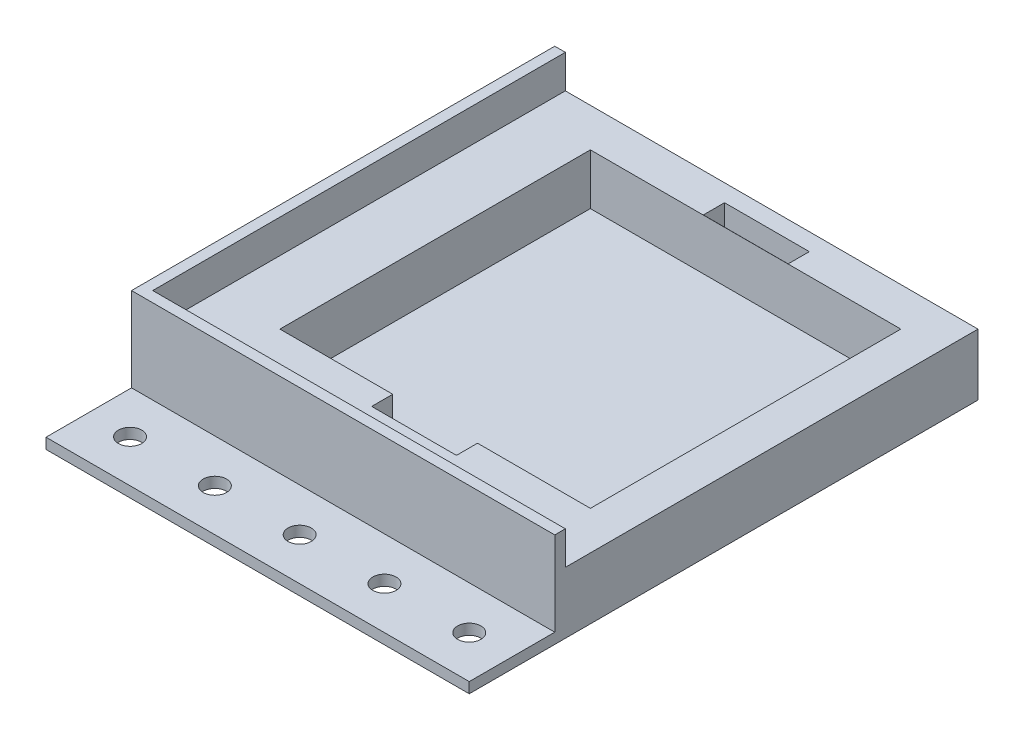
ISO-10303-21;
HEADER;
FILE_DESCRIPTION(('STEP AP214'),'2;1');
FILE_NAME('part.step','',(''),(''),'','','');
FILE_SCHEMA(('AUTOMOTIVE_DESIGN { 1 0 10303 214 1 1 1 1 }'));
ENDSEC;
DATA;
#1=APPLICATION_CONTEXT('core data for automotive mechanical design processes');
#2=APPLICATION_PROTOCOL_DEFINITION('international standard','automotive_design',2000,#1);
#3=PRODUCT_CONTEXT('',#1,'mechanical');
#4=PRODUCT('Part','Part','',(#3));
#5=PRODUCT_RELATED_PRODUCT_CATEGORY('part','',(#4));
#6=PRODUCT_DEFINITION_FORMATION('','',#4);
#7=PRODUCT_DEFINITION_CONTEXT('part definition',#1,'design');
#8=PRODUCT_DEFINITION('design','',#6,#7);
#9=PRODUCT_DEFINITION_SHAPE('','',#8);
#10=(LENGTH_UNIT() NAMED_UNIT(*) SI_UNIT(.MILLI.,.METRE.));
#11=(NAMED_UNIT(*) PLANE_ANGLE_UNIT() SI_UNIT($,.RADIAN.));
#12=(NAMED_UNIT(*) SI_UNIT($,.STERADIAN.) SOLID_ANGLE_UNIT());
#13=UNCERTAINTY_MEASURE_WITH_UNIT(LENGTH_MEASURE(1.E-05),#10,'distance_accuracy_value','');
#14=(GEOMETRIC_REPRESENTATION_CONTEXT(3) GLOBAL_UNCERTAINTY_ASSIGNED_CONTEXT((#13)) GLOBAL_UNIT_ASSIGNED_CONTEXT((#10,
#11,#12)) REPRESENTATION_CONTEXT('',''));
#15=CARTESIAN_POINT('',(0.,0.,0.));
#16=DIRECTION('',(0.,0.,1.));
#17=DIRECTION('',(1.,0.,0.));
#18=AXIS2_PLACEMENT_3D('',#15,#16,#17);
#19=CARTESIAN_POINT('',(0.,0.,0.));
#20=DIRECTION('',(0.,-1.,0.));
#21=DIRECTION('',(0.,0.,-1.));
#22=AXIS2_PLACEMENT_3D('',#19,#20,#21);
#23=PLANE('',#22);
#24=CARTESIAN_POINT('',(-12.7,0.,139.7));
#25=DIRECTION('',(0.,1.,0.));
#26=DIRECTION('',(0.,0.,1.));
#27=AXIS2_PLACEMENT_3D('',#24,#25,#26);
#28=CIRCLE('',#27,3.4925);
#29=CARTESIAN_POINT('',(-12.7,0.,143.1925));
#30=VERTEX_POINT('',#29);
#31=EDGE_CURVE('E273',#30,#30,#28,.T.);
#32=ORIENTED_EDGE('',*,*,#31,.F.);
#33=EDGE_LOOP('',(#32));
#34=FACE_BOUND('',#33,.T.);
#35=CARTESIAN_POINT('',(-38.1,0.,139.7));
#36=DIRECTION('',(0.,1.,0.));
#37=DIRECTION('',(0.,0.,1.));
#38=AXIS2_PLACEMENT_3D('',#35,#36,#37);
#39=CIRCLE('',#38,3.4925);
#40=CARTESIAN_POINT('',(-38.1,0.,143.1925));
#41=VERTEX_POINT('',#40);
#42=EDGE_CURVE('E296',#41,#41,#39,.T.);
#43=ORIENTED_EDGE('',*,*,#42,.F.);
#44=EDGE_LOOP('',(#43));
#45=FACE_BOUND('',#44,.T.);
#46=CARTESIAN_POINT('',(-63.5,0.,139.7));
#47=DIRECTION('',(0.,1.,0.));
#48=DIRECTION('',(0.,0.,1.));
#49=AXIS2_PLACEMENT_3D('',#46,#47,#48);
#50=CIRCLE('',#49,3.4925);
#51=CARTESIAN_POINT('',(-63.5,0.,143.1925));
#52=VERTEX_POINT('',#51);
#53=EDGE_CURVE('E290',#52,#52,#50,.T.);
#54=ORIENTED_EDGE('',*,*,#53,.F.);
#55=EDGE_LOOP('',(#54));
#56=FACE_BOUND('',#55,.T.);
#57=CARTESIAN_POINT('',(-88.9,0.,139.7));
#58=DIRECTION('',(0.,1.,0.));
#59=DIRECTION('',(0.,0.,1.));
#60=AXIS2_PLACEMENT_3D('',#57,#58,#59);
#61=CIRCLE('',#60,3.4925);
#62=CARTESIAN_POINT('',(-88.9,0.,143.1925));
#63=VERTEX_POINT('',#62);
#64=EDGE_CURVE('E284',#63,#63,#61,.T.);
#65=ORIENTED_EDGE('',*,*,#64,.F.);
#66=EDGE_LOOP('',(#65));
#67=FACE_BOUND('',#66,.T.);
#68=CARTESIAN_POINT('',(-114.3,0.,139.7));
#69=DIRECTION('',(0.,1.,0.));
#70=DIRECTION('',(0.,0.,1.));
#71=AXIS2_PLACEMENT_3D('',#68,#69,#70);
#72=CIRCLE('',#71,3.4925);
#73=CARTESIAN_POINT('',(-114.3,0.,143.1925));
#74=VERTEX_POINT('',#73);
#75=EDGE_CURVE('E278',#74,#74,#72,.T.);
#76=ORIENTED_EDGE('',*,*,#75,.F.);
#77=EDGE_LOOP('',(#76));
#78=FACE_BOUND('',#77,.T.);
#79=DIRECTION('',(0.,0.,1.));
#80=VECTOR('',#79,1.);
#81=CARTESIAN_POINT('',(0.,0.,0.));
#82=LINE('',#81,#80);
#83=CARTESIAN_POINT('',(0.,0.,126.782));
#84=VERTEX_POINT('',#83);
#85=CARTESIAN_POINT('',(0.,0.,152.4));
#86=VERTEX_POINT('',#85);
#87=EDGE_CURVE('E195',#84,#86,#82,.T.);
#88=ORIENTED_EDGE('',*,*,#87,.F.);
#89=DIRECTION('',(1.,0.,0.));
#90=VECTOR('',#89,1.);
#91=CARTESIAN_POINT('',(-126.782,0.,126.782));
#92=LINE('',#91,#90);
#93=CARTESIAN_POINT('',(-126.782,0.,126.782));
#94=VERTEX_POINT('',#93);
#95=EDGE_CURVE('E307',#94,#84,#92,.T.);
#96=ORIENTED_EDGE('',*,*,#95,.F.);
#97=DIRECTION('',(0.,0.,1.));
#98=VECTOR('',#97,1.);
#99=CARTESIAN_POINT('',(-126.782,0.,0.));
#100=LINE('',#99,#98);
#101=CARTESIAN_POINT('',(-126.782,0.,152.4));
#102=VERTEX_POINT('',#101);
#103=EDGE_CURVE('E214',#94,#102,#100,.T.);
#104=ORIENTED_EDGE('',*,*,#103,.T.);
#105=DIRECTION('',(-1.,0.,0.));
#106=VECTOR('',#105,1.);
#107=CARTESIAN_POINT('',(-152.4,0.,152.4));
#108=LINE('',#107,#106);
#109=EDGE_CURVE('E312',#86,#102,#108,.T.);
#110=ORIENTED_EDGE('',*,*,#109,.F.);
#111=EDGE_LOOP('',(#88,#96,#104,#110));
#112=FACE_BOUND('',#111,.T.);
#113=ADVANCED_FACE('F37',(#34,#45,#56,#67,#78,#112),#23,.F.);
#114=CARTESIAN_POINT('',(0.,-3.175,0.));
#115=DIRECTION('',(0.,-1.,0.));
#116=DIRECTION('',(0.,0.,-1.));
#117=AXIS2_PLACEMENT_3D('',#114,#115,#116);
#118=PLANE('',#117);
#119=CARTESIAN_POINT('',(-12.7,-3.175,139.7));
#120=DIRECTION('',(0.,1.,0.));
#121=DIRECTION('',(0.,0.,1.));
#122=AXIS2_PLACEMENT_3D('',#119,#120,#121);
#123=CIRCLE('',#122,3.4925);
#124=CARTESIAN_POINT('',(-12.7,-3.175,143.1925));
#125=VERTEX_POINT('',#124);
#126=EDGE_CURVE('E299',#125,#125,#123,.T.);
#127=ORIENTED_EDGE('',*,*,#126,.T.);
#128=EDGE_LOOP('',(#127));
#129=FACE_BOUND('',#128,.T.);
#130=CARTESIAN_POINT('',(-38.1,-3.175,139.7));
#131=DIRECTION('',(0.,1.,0.));
#132=DIRECTION('',(0.,0.,1.));
#133=AXIS2_PLACEMENT_3D('',#130,#131,#132);
#134=CIRCLE('',#133,3.4925);
#135=CARTESIAN_POINT('',(-38.1,-3.175,143.1925));
#136=VERTEX_POINT('',#135);
#137=EDGE_CURVE('E293',#136,#136,#134,.T.);
#138=ORIENTED_EDGE('',*,*,#137,.T.);
#139=EDGE_LOOP('',(#138));
#140=FACE_BOUND('',#139,.T.);
#141=CARTESIAN_POINT('',(-63.5,-3.175,139.7));
#142=DIRECTION('',(0.,1.,0.));
#143=DIRECTION('',(0.,0.,1.));
#144=AXIS2_PLACEMENT_3D('',#141,#142,#143);
#145=CIRCLE('',#144,3.4925);
#146=CARTESIAN_POINT('',(-63.5,-3.175,143.1925));
#147=VERTEX_POINT('',#146);
#148=EDGE_CURVE('E287',#147,#147,#145,.T.);
#149=ORIENTED_EDGE('',*,*,#148,.T.);
#150=EDGE_LOOP('',(#149));
#151=FACE_BOUND('',#150,.T.);
#152=CARTESIAN_POINT('',(-88.9,-3.175,139.7));
#153=DIRECTION('',(0.,1.,0.));
#154=DIRECTION('',(0.,0.,1.));
#155=AXIS2_PLACEMENT_3D('',#152,#153,#154);
#156=CIRCLE('',#155,3.4925);
#157=CARTESIAN_POINT('',(-88.9,-3.175,143.1925));
#158=VERTEX_POINT('',#157);
#159=EDGE_CURVE('E281',#158,#158,#156,.T.);
#160=ORIENTED_EDGE('',*,*,#159,.T.);
#161=EDGE_LOOP('',(#160));
#162=FACE_BOUND('',#161,.T.);
#163=CARTESIAN_POINT('',(-114.3,-3.175,139.7));
#164=DIRECTION('',(0.,1.,0.));
#165=DIRECTION('',(0.,0.,1.));
#166=AXIS2_PLACEMENT_3D('',#163,#164,#165);
#167=CIRCLE('',#166,3.4925);
#168=CARTESIAN_POINT('',(-114.3,-3.175,143.1925));
#169=VERTEX_POINT('',#168);
#170=EDGE_CURVE('E274',#169,#169,#167,.T.);
#171=ORIENTED_EDGE('',*,*,#170,.T.);
#172=EDGE_LOOP('',(#171));
#173=FACE_BOUND('',#172,.T.);
#174=DIRECTION('',(0.,0.,1.));
#175=VECTOR('',#174,1.);
#176=CARTESIAN_POINT('',(-126.782,-3.175,0.));
#177=LINE('',#176,#175);
#178=CARTESIAN_POINT('',(-126.782,-3.175,0.));
#179=VERTEX_POINT('',#178);
#180=CARTESIAN_POINT('',(-126.782,-3.175,152.4));
#181=VERTEX_POINT('',#180);
#182=EDGE_CURVE('E198',#179,#181,#177,.T.);
#183=ORIENTED_EDGE('',*,*,#182,.F.);
#184=DIRECTION('',(-1.,0.,0.));
#185=VECTOR('',#184,1.);
#186=CARTESIAN_POINT('',(-142.114384532222,-3.175,0.));
#187=LINE('',#186,#185);
#188=CARTESIAN_POINT('',(0.,-3.175,0.));
#189=VERTEX_POINT('',#188);
#190=EDGE_CURVE('E188',#189,#179,#187,.T.);
#191=ORIENTED_EDGE('',*,*,#190,.F.);
#192=DIRECTION('',(0.,0.,-1.));
#193=VECTOR('',#192,1.);
#194=CARTESIAN_POINT('',(0.,-3.175,0.));
#195=LINE('',#194,#193);
#196=CARTESIAN_POINT('',(0.,-3.175,152.4));
#197=VERTEX_POINT('',#196);
#198=EDGE_CURVE('E180',#197,#189,#195,.T.);
#199=ORIENTED_EDGE('',*,*,#198,.F.);
#200=DIRECTION('',(-1.,0.,0.));
#201=VECTOR('',#200,1.);
#202=CARTESIAN_POINT('',(-152.4,-3.175,152.4));
#203=LINE('',#202,#201);
#204=EDGE_CURVE('E60',#197,#181,#203,.T.);
#205=ORIENTED_EDGE('',*,*,#204,.T.);
#206=EDGE_LOOP('',(#183,#191,#199,#205));
#207=FACE_BOUND('',#206,.T.);
#208=ADVANCED_FACE('F197',(#129,#140,#151,#162,#173,#207),#118,.T.);
#209=CARTESIAN_POINT('',(-152.4,15.24,152.4));
#210=DIRECTION('',(0.,0.,-1.));
#211=DIRECTION('',(-1.,0.,0.));
#212=AXIS2_PLACEMENT_3D('',#209,#210,#211);
#213=PLANE('',#212);
#214=DIRECTION('',(0.,-1.,0.));
#215=VECTOR('',#214,1.);
#216=CARTESIAN_POINT('',(0.,15.24,152.4));
#217=LINE('',#216,#215);
#218=EDGE_CURVE('E186',#86,#197,#217,.T.);
#219=ORIENTED_EDGE('',*,*,#218,.F.);
#220=ORIENTED_EDGE('',*,*,#109,.T.);
#221=DIRECTION('',(0.,-1.,0.));
#222=VECTOR('',#221,1.);
#223=CARTESIAN_POINT('',(-126.782,15.24,152.4));
#224=LINE('',#223,#222);
#225=EDGE_CURVE('E364',#102,#181,#224,.T.);
#226=ORIENTED_EDGE('',*,*,#225,.T.);
#227=ORIENTED_EDGE('',*,*,#204,.F.);
#228=EDGE_LOOP('',(#219,#220,#226,#227));
#229=FACE_BOUND('',#228,.T.);
#230=ADVANCED_FACE('F39',(#229),#213,.F.);
#231=CARTESIAN_POINT('',(0.,25.24,0.));
#232=DIRECTION('',(0.,-1.,0.));
#233=DIRECTION('',(0.,0.,-1.));
#234=AXIS2_PLACEMENT_3D('',#231,#232,#233);
#235=PLANE('',#234);
#236=DIRECTION('',(-1.,0.,0.));
#237=VECTOR('',#236,1.);
#238=CARTESIAN_POINT('',(-142.114384532222,25.24,0.));
#239=LINE('',#238,#237);
#240=CARTESIAN_POINT('',(-123.607,25.24,0.));
#241=VERTEX_POINT('',#240);
#242=CARTESIAN_POINT('',(-126.782,25.24,0.));
#243=VERTEX_POINT('',#242);
#244=EDGE_CURVE('E189',#241,#243,#239,.T.);
#245=ORIENTED_EDGE('',*,*,#244,.T.);
#246=DIRECTION('',(0.,0.,1.));
#247=VECTOR('',#246,1.);
#248=CARTESIAN_POINT('',(-126.782,25.24,-126.782));
#249=LINE('',#248,#247);
#250=CARTESIAN_POINT('',(-126.782,25.24,126.782));
#251=VERTEX_POINT('',#250);
#252=EDGE_CURVE('E277',#243,#251,#249,.T.);
#253=ORIENTED_EDGE('',*,*,#252,.T.);
#254=DIRECTION('',(1.,0.,0.));
#255=VECTOR('',#254,1.);
#256=CARTESIAN_POINT('',(-126.782,25.24,126.782));
#257=LINE('',#256,#255);
#258=CARTESIAN_POINT('',(0.,25.24,126.782));
#259=VERTEX_POINT('',#258);
#260=EDGE_CURVE('E304',#251,#259,#257,.T.);
#261=ORIENTED_EDGE('',*,*,#260,.T.);
#262=DIRECTION('',(0.,0.,-1.));
#263=VECTOR('',#262,1.);
#264=CARTESIAN_POINT('',(0.,25.24,0.));
#265=LINE('',#264,#263);
#266=CARTESIAN_POINT('',(0.,25.24,123.607));
#267=VERTEX_POINT('',#266);
#268=EDGE_CURVE('E52',#259,#267,#265,.T.);
#269=ORIENTED_EDGE('',*,*,#268,.T.);
#270=DIRECTION('',(1.,0.,0.));
#271=VECTOR('',#270,1.);
#272=CARTESIAN_POINT('',(-123.607,25.24,123.607));
#273=LINE('',#272,#271);
#274=CARTESIAN_POINT('',(-123.607,25.24,123.607));
#275=VERTEX_POINT('',#274);
#276=EDGE_CURVE('E319',#275,#267,#273,.T.);
#277=ORIENTED_EDGE('',*,*,#276,.F.);
#278=DIRECTION('',(0.,0.,1.));
#279=VECTOR('',#278,1.);
#280=CARTESIAN_POINT('',(-123.607,25.24,123.607));
#281=LINE('',#280,#279);
#282=EDGE_CURVE('E317',#241,#275,#281,.T.);
#283=ORIENTED_EDGE('',*,*,#282,.F.);
#284=EDGE_LOOP('',(#245,#253,#261,#269,#277,#283));
#285=FACE_BOUND('',#284,.T.);
#286=ADVANCED_FACE('F374',(#285),#235,.F.);
#287=CARTESIAN_POINT('',(0.,15.24,0.));
#288=DIRECTION('',(0.,-1.,0.));
#289=DIRECTION('',(0.,0.,-1.));
#290=AXIS2_PLACEMENT_3D('',#287,#288,#289);
#291=PLANE('',#290);
#292=DIRECTION('',(1.,0.,0.));
#293=VECTOR('',#292,1.);
#294=CARTESIAN_POINT('',(-104.557,15.24,104.557));
#295=LINE('',#294,#293);
#296=CARTESIAN_POINT('',(-45.357,15.24,104.557));
#297=VERTEX_POINT('',#296);
#298=CARTESIAN_POINT('',(-11.557,15.24,104.557));
#299=VERTEX_POINT('',#298);
#300=EDGE_CURVE('E339',#297,#299,#295,.T.);
#301=ORIENTED_EDGE('',*,*,#300,.F.);
#302=DIRECTION('',(0.,0.,-1.));
#303=VECTOR('',#302,1.);
#304=CARTESIAN_POINT('',(-45.357,15.24,104.521));
#305=LINE('',#304,#303);
#306=CARTESIAN_POINT('',(-45.357,15.24,110.871));
#307=VERTEX_POINT('',#306);
#308=EDGE_CURVE('E218',#307,#297,#305,.T.);
#309=ORIENTED_EDGE('',*,*,#308,.F.);
#310=DIRECTION('',(1.,0.,0.));
#311=VECTOR('',#310,1.);
#312=CARTESIAN_POINT('',(-70.757,15.24,110.871));
#313=LINE('',#312,#311);
#314=CARTESIAN_POINT('',(-70.757,15.24,110.871));
#315=VERTEX_POINT('',#314);
#316=EDGE_CURVE('E221',#315,#307,#313,.T.);
#317=ORIENTED_EDGE('',*,*,#316,.F.);
#318=DIRECTION('',(0.,0.,1.));
#319=VECTOR('',#318,1.);
#320=CARTESIAN_POINT('',(-70.757,15.24,104.521));
#321=LINE('',#320,#319);
#322=CARTESIAN_POINT('',(-70.757,15.24,104.557));
#323=VERTEX_POINT('',#322);
#324=EDGE_CURVE('E217',#323,#315,#321,.T.);
#325=ORIENTED_EDGE('',*,*,#324,.F.);
#326=CARTESIAN_POINT('',(-104.557,15.24,104.557));
#327=VERTEX_POINT('',#326);
#328=EDGE_CURVE('E340',#327,#323,#295,.T.);
#329=ORIENTED_EDGE('',*,*,#328,.F.);
#330=DIRECTION('',(0.,0.,1.));
#331=VECTOR('',#330,1.);
#332=CARTESIAN_POINT('',(-104.557,15.24,11.557));
#333=LINE('',#332,#331);
#334=CARTESIAN_POINT('',(-104.557,15.24,11.557));
#335=VERTEX_POINT('',#334);
#336=EDGE_CURVE('E336',#335,#327,#333,.T.);
#337=ORIENTED_EDGE('',*,*,#336,.F.);
#338=DIRECTION('',(-1.,0.,0.));
#339=VECTOR('',#338,1.);
#340=CARTESIAN_POINT('',(-104.557,15.24,11.557));
#341=LINE('',#340,#339);
#342=CARTESIAN_POINT('',(-11.557,15.24,11.557));
#343=VERTEX_POINT('',#342);
#344=EDGE_CURVE('E333',#343,#335,#341,.T.);
#345=ORIENTED_EDGE('',*,*,#344,.F.);
#346=DIRECTION('',(0.,0.,-1.));
#347=VECTOR('',#346,1.);
#348=CARTESIAN_POINT('',(-11.557,15.24,11.557));
#349=LINE('',#348,#347);
#350=EDGE_CURVE('E331',#299,#343,#349,.T.);
#351=ORIENTED_EDGE('',*,*,#350,.F.);
#352=EDGE_LOOP('',(#301,#309,#317,#325,#329,#337,#345,#351));
#353=FACE_BOUND('',#352,.T.);
#354=DIRECTION('',(0.,0.,-1.));
#355=VECTOR('',#354,1.);
#356=CARTESIAN_POINT('',(-45.357,15.24,11.521));
#357=LINE('',#356,#355);
#358=CARTESIAN_POINT('',(-45.357,15.24,11.521));
#359=VERTEX_POINT('',#358);
#360=CARTESIAN_POINT('',(-45.357,15.24,5.17099999999997));
#361=VERTEX_POINT('',#360);
#362=EDGE_CURVE('E245',#359,#361,#357,.T.);
#363=ORIENTED_EDGE('',*,*,#362,.F.);
#364=DIRECTION('',(1.,0.,0.));
#365=VECTOR('',#364,1.);
#366=CARTESIAN_POINT('',(-70.757,15.24,11.521));
#367=LINE('',#366,#365);
#368=CARTESIAN_POINT('',(-70.757,15.24,11.521));
#369=VERTEX_POINT('',#368);
#370=EDGE_CURVE('E248',#369,#359,#367,.T.);
#371=ORIENTED_EDGE('',*,*,#370,.F.);
#372=DIRECTION('',(0.,0.,1.));
#373=VECTOR('',#372,1.);
#374=CARTESIAN_POINT('',(-70.757,15.24,11.521));
#375=LINE('',#374,#373);
#376=CARTESIAN_POINT('',(-70.757,15.24,5.17099999999997));
#377=VERTEX_POINT('',#376);
#378=EDGE_CURVE('E241',#377,#369,#375,.T.);
#379=ORIENTED_EDGE('',*,*,#378,.F.);
#380=DIRECTION('',(-1.,0.,0.));
#381=VECTOR('',#380,1.);
#382=CARTESIAN_POINT('',(-70.757,15.24,5.17099999999997));
#383=LINE('',#382,#381);
#384=EDGE_CURVE('E242',#361,#377,#383,.T.);
#385=ORIENTED_EDGE('',*,*,#384,.F.);
#386=EDGE_LOOP('',(#363,#371,#379,#385));
#387=FACE_BOUND('',#386,.T.);
#388=DIRECTION('',(1.,0.,0.));
#389=VECTOR('',#388,1.);
#390=CARTESIAN_POINT('',(0.,15.24,0.));
#391=LINE('',#390,#389);
#392=CARTESIAN_POINT('',(-123.607,15.24,0.));
#393=VERTEX_POINT('',#392);
#394=CARTESIAN_POINT('',(0.,15.24,0.));
#395=VERTEX_POINT('',#394);
#396=EDGE_CURVE('E194',#393,#395,#391,.T.);
#397=ORIENTED_EDGE('',*,*,#396,.F.);
#398=DIRECTION('',(0.,0.,1.));
#399=VECTOR('',#398,1.);
#400=CARTESIAN_POINT('',(-123.607,15.24,123.607));
#401=LINE('',#400,#399);
#402=CARTESIAN_POINT('',(-123.607,15.24,123.607));
#403=VERTEX_POINT('',#402);
#404=EDGE_CURVE('E316',#393,#403,#401,.T.);
#405=ORIENTED_EDGE('',*,*,#404,.T.);
#406=DIRECTION('',(1.,0.,0.));
#407=VECTOR('',#406,1.);
#408=CARTESIAN_POINT('',(-123.607,15.24,123.607));
#409=LINE('',#408,#407);
#410=CARTESIAN_POINT('',(0.,15.24,123.607));
#411=VERTEX_POINT('',#410);
#412=EDGE_CURVE('E320',#403,#411,#409,.T.);
#413=ORIENTED_EDGE('',*,*,#412,.T.);
#414=DIRECTION('',(0.,0.,1.));
#415=VECTOR('',#414,1.);
#416=CARTESIAN_POINT('',(0.,15.24,0.));
#417=LINE('',#416,#415);
#418=EDGE_CURVE('E207',#395,#411,#417,.T.);
#419=ORIENTED_EDGE('',*,*,#418,.F.);
#420=EDGE_LOOP('',(#397,#405,#413,#419));
#421=FACE_BOUND('',#420,.T.);
#422=ADVANCED_FACE('F392',(#353,#387,#421),#291,.F.);
#423=CARTESIAN_POINT('',(-123.607,25.24,123.607));
#424=DIRECTION('',(1.,0.,0.));
#425=DIRECTION('',(0.,0.,-1.));
#426=AXIS2_PLACEMENT_3D('',#423,#424,#425);
#427=PLANE('',#426);
#428=ORIENTED_EDGE('',*,*,#404,.F.);
#429=DIRECTION('',(0.,1.,0.));
#430=VECTOR('',#429,1.);
#431=CARTESIAN_POINT('',(-123.607,25.24,0.));
#432=LINE('',#431,#430);
#433=EDGE_CURVE('E209',#393,#241,#432,.T.);
#434=ORIENTED_EDGE('',*,*,#433,.T.);
#435=ORIENTED_EDGE('',*,*,#282,.T.);
#436=DIRECTION('',(0.,-1.,0.));
#437=VECTOR('',#436,1.);
#438=CARTESIAN_POINT('',(-123.607,25.24,123.607));
#439=LINE('',#438,#437);
#440=EDGE_CURVE('E323',#275,#403,#439,.T.);
#441=ORIENTED_EDGE('',*,*,#440,.T.);
#442=EDGE_LOOP('',(#428,#434,#435,#441));
#443=FACE_BOUND('',#442,.T.);
#444=ADVANCED_FACE('F386',(#443),#427,.T.);
#445=CARTESIAN_POINT('',(-123.607,25.24,123.607));
#446=DIRECTION('',(0.,0.,-1.));
#447=DIRECTION('',(-1.,0.,0.));
#448=AXIS2_PLACEMENT_3D('',#445,#446,#447);
#449=PLANE('',#448);
#450=ORIENTED_EDGE('',*,*,#276,.T.);
#451=DIRECTION('',(0.,-1.,0.));
#452=VECTOR('',#451,1.);
#453=CARTESIAN_POINT('',(0.,25.24,123.607));
#454=LINE('',#453,#452);
#455=EDGE_CURVE('E204',#267,#411,#454,.T.);
#456=ORIENTED_EDGE('',*,*,#455,.T.);
#457=ORIENTED_EDGE('',*,*,#412,.F.);
#458=ORIENTED_EDGE('',*,*,#440,.F.);
#459=EDGE_LOOP('',(#450,#456,#457,#458));
#460=FACE_BOUND('',#459,.T.);
#461=ADVANCED_FACE('F389',(#460),#449,.T.);
#462=CARTESIAN_POINT('',(-126.782,-438.537816749432,-126.782));
#463=DIRECTION('',(-1.,0.,0.));
#464=DIRECTION('',(0.,0.,1.));
#465=AXIS2_PLACEMENT_3D('',#462,#463,#464);
#466=PLANE('',#465);
#467=ORIENTED_EDGE('',*,*,#252,.F.);
#468=DIRECTION('',(0.,-1.,0.));
#469=VECTOR('',#468,1.);
#470=CARTESIAN_POINT('',(-126.782,-438.537816749432,0.));
#471=LINE('',#470,#469);
#472=EDGE_CURVE('E13',#243,#179,#471,.T.);
#473=ORIENTED_EDGE('',*,*,#472,.T.);
#474=ORIENTED_EDGE('',*,*,#182,.T.);
#475=ORIENTED_EDGE('',*,*,#225,.F.);
#476=ORIENTED_EDGE('',*,*,#103,.F.);
#477=DIRECTION('',(0.,1.,0.));
#478=VECTOR('',#477,1.);
#479=CARTESIAN_POINT('',(-126.782,-438.537816749432,126.782));
#480=LINE('',#479,#478);
#481=EDGE_CURVE('E308',#94,#251,#480,.T.);
#482=ORIENTED_EDGE('',*,*,#481,.T.);
#483=EDGE_LOOP('',(#467,#473,#474,#475,#476,#482));
#484=FACE_BOUND('',#483,.T.);
#485=ADVANCED_FACE('F379',(#484),#466,.T.);
#486=CARTESIAN_POINT('',(-126.782,-438.537816749432,126.782));
#487=DIRECTION('',(0.,0.,1.));
#488=DIRECTION('',(1.,0.,0.));
#489=AXIS2_PLACEMENT_3D('',#486,#487,#488);
#490=PLANE('',#489);
#491=ORIENTED_EDGE('',*,*,#95,.T.);
#492=DIRECTION('',(0.,1.,0.));
#493=VECTOR('',#492,1.);
#494=CARTESIAN_POINT('',(0.,-438.537816749432,126.782));
#495=LINE('',#494,#493);
#496=EDGE_CURVE('E45',#84,#259,#495,.T.);
#497=ORIENTED_EDGE('',*,*,#496,.T.);
#498=ORIENTED_EDGE('',*,*,#260,.F.);
#499=ORIENTED_EDGE('',*,*,#481,.F.);
#500=EDGE_LOOP('',(#491,#497,#498,#499));
#501=FACE_BOUND('',#500,.T.);
#502=ADVANCED_FACE('F368',(#501),#490,.T.);
#503=CARTESIAN_POINT('',(-104.557,15.24,104.557));
#504=DIRECTION('',(0.,0.,-1.));
#505=DIRECTION('',(-1.,0.,0.));
#506=AXIS2_PLACEMENT_3D('',#503,#504,#505);
#507=PLANE('',#506);
#508=DIRECTION('',(0.,-1.,0.));
#509=VECTOR('',#508,1.);
#510=CARTESIAN_POINT('',(-45.357,15.24,104.557));
#511=LINE('',#510,#509);
#512=CARTESIAN_POINT('',(-45.357,0.,104.557));
#513=VERTEX_POINT('',#512);
#514=EDGE_CURVE('E239',#297,#513,#511,.T.);
#515=ORIENTED_EDGE('',*,*,#514,.F.);
#516=ORIENTED_EDGE('',*,*,#300,.T.);
#517=DIRECTION('',(0.,-1.,0.));
#518=VECTOR('',#517,1.);
#519=CARTESIAN_POINT('',(-11.557,15.24,104.557));
#520=LINE('',#519,#518);
#521=CARTESIAN_POINT('',(-11.557,0.,104.557));
#522=VERTEX_POINT('',#521);
#523=EDGE_CURVE('E343',#299,#522,#520,.T.);
#524=ORIENTED_EDGE('',*,*,#523,.T.);
#525=DIRECTION('',(1.,0.,0.));
#526=VECTOR('',#525,1.);
#527=CARTESIAN_POINT('',(-104.557,0.,104.557));
#528=LINE('',#527,#526);
#529=EDGE_CURVE('E352',#513,#522,#528,.T.);
#530=ORIENTED_EDGE('',*,*,#529,.F.);
#531=EDGE_LOOP('',(#515,#516,#524,#530));
#532=FACE_BOUND('',#531,.T.);
#533=ADVANCED_FACE('F430',(#532),#507,.T.);
#534=CARTESIAN_POINT('',(-11.557,15.24,11.557));
#535=DIRECTION('',(-1.,0.,0.));
#536=DIRECTION('',(0.,0.,1.));
#537=AXIS2_PLACEMENT_3D('',#534,#535,#536);
#538=PLANE('',#537);
#539=DIRECTION('',(0.,0.,-1.));
#540=VECTOR('',#539,1.);
#541=CARTESIAN_POINT('',(-11.557,0.,11.557));
#542=LINE('',#541,#540);
#543=CARTESIAN_POINT('',(-11.557,0.,11.557));
#544=VERTEX_POINT('',#543);
#545=EDGE_CURVE('E330',#522,#544,#542,.T.);
#546=ORIENTED_EDGE('',*,*,#545,.F.);
#547=ORIENTED_EDGE('',*,*,#523,.F.);
#548=ORIENTED_EDGE('',*,*,#350,.T.);
#549=DIRECTION('',(0.,-1.,0.));
#550=VECTOR('',#549,1.);
#551=CARTESIAN_POINT('',(-11.557,15.24,11.557));
#552=LINE('',#551,#550);
#553=EDGE_CURVE('E361',#343,#544,#552,.T.);
#554=ORIENTED_EDGE('',*,*,#553,.T.);
#555=EDGE_LOOP('',(#546,#547,#548,#554));
#556=FACE_BOUND('',#555,.T.);
#557=ADVANCED_FACE('F436',(#556),#538,.T.);
#558=CARTESIAN_POINT('',(-104.557,15.24,11.557));
#559=DIRECTION('',(0.,0.,1.));
#560=DIRECTION('',(1.,0.,0.));
#561=AXIS2_PLACEMENT_3D('',#558,#559,#560);
#562=PLANE('',#561);
#563=DIRECTION('',(-1.,0.,0.));
#564=VECTOR('',#563,1.);
#565=CARTESIAN_POINT('',(-104.557,0.,11.557));
#566=LINE('',#565,#564);
#567=CARTESIAN_POINT('',(-104.557,0.,11.557));
#568=VERTEX_POINT('',#567);
#569=EDGE_CURVE('E346',#544,#568,#566,.T.);
#570=ORIENTED_EDGE('',*,*,#569,.F.);
#571=ORIENTED_EDGE('',*,*,#553,.F.);
#572=ORIENTED_EDGE('',*,*,#344,.T.);
#573=DIRECTION('',(0.,-1.,0.));
#574=VECTOR('',#573,1.);
#575=CARTESIAN_POINT('',(-104.557,15.24,11.557));
#576=LINE('',#575,#574);
#577=EDGE_CURVE('E359',#335,#568,#576,.T.);
#578=ORIENTED_EDGE('',*,*,#577,.T.);
#579=EDGE_LOOP('',(#570,#571,#572,#578));
#580=FACE_BOUND('',#579,.T.);
#581=ADVANCED_FACE('F433',(#580),#562,.T.);
#582=CARTESIAN_POINT('',(-104.557,15.24,11.557));
#583=DIRECTION('',(1.,0.,0.));
#584=DIRECTION('',(0.,0.,-1.));
#585=AXIS2_PLACEMENT_3D('',#582,#583,#584);
#586=PLANE('',#585);
#587=DIRECTION('',(0.,0.,1.));
#588=VECTOR('',#587,1.);
#589=CARTESIAN_POINT('',(-104.557,0.,11.557));
#590=LINE('',#589,#588);
#591=CARTESIAN_POINT('',(-104.557,0.,104.557));
#592=VERTEX_POINT('',#591);
#593=EDGE_CURVE('E349',#568,#592,#590,.T.);
#594=ORIENTED_EDGE('',*,*,#593,.F.);
#595=ORIENTED_EDGE('',*,*,#577,.F.);
#596=ORIENTED_EDGE('',*,*,#336,.T.);
#597=DIRECTION('',(0.,-1.,0.));
#598=VECTOR('',#597,1.);
#599=CARTESIAN_POINT('',(-104.557,15.24,104.557));
#600=LINE('',#599,#598);
#601=EDGE_CURVE('E357',#327,#592,#600,.T.);
#602=ORIENTED_EDGE('',*,*,#601,.T.);
#603=EDGE_LOOP('',(#594,#595,#596,#602));
#604=FACE_BOUND('',#603,.T.);
#605=ADVANCED_FACE('F428',(#604),#586,.T.);
#606=DIRECTION('',(0.,1.,0.));
#607=VECTOR('',#606,1.);
#608=CARTESIAN_POINT('',(-70.757,15.24,104.557));
#609=LINE('',#608,#607);
#610=CARTESIAN_POINT('',(-70.757,0.,104.557));
#611=VERTEX_POINT('',#610);
#612=EDGE_CURVE('E237',#611,#323,#609,.T.);
#613=ORIENTED_EDGE('',*,*,#612,.F.);
#614=EDGE_CURVE('E334',#592,#611,#528,.T.);
#615=ORIENTED_EDGE('',*,*,#614,.F.);
#616=ORIENTED_EDGE('',*,*,#601,.F.);
#617=ORIENTED_EDGE('',*,*,#328,.T.);
#618=EDGE_LOOP('',(#613,#615,#616,#617));
#619=FACE_BOUND('',#618,.T.);
#620=ADVANCED_FACE('F424',(#619),#507,.T.);
#621=CARTESIAN_POINT('',(0.,0.,0.));
#622=DIRECTION('',(0.,-1.,0.));
#623=DIRECTION('',(0.,0.,-1.));
#624=AXIS2_PLACEMENT_3D('',#621,#622,#623);
#625=PLANE('',#624);
#626=ORIENTED_EDGE('',*,*,#614,.T.);
#627=DIRECTION('',(0.,0.,1.));
#628=VECTOR('',#627,1.);
#629=CARTESIAN_POINT('',(-70.757,0.,104.521));
#630=LINE('',#629,#628);
#631=CARTESIAN_POINT('',(-70.757,0.,110.871));
#632=VERTEX_POINT('',#631);
#633=EDGE_CURVE('E228',#611,#632,#630,.T.);
#634=ORIENTED_EDGE('',*,*,#633,.T.);
#635=DIRECTION('',(1.,0.,0.));
#636=VECTOR('',#635,1.);
#637=CARTESIAN_POINT('',(-70.757,0.,110.871));
#638=LINE('',#637,#636);
#639=CARTESIAN_POINT('',(-45.357,0.,110.871));
#640=VERTEX_POINT('',#639);
#641=EDGE_CURVE('E220',#632,#640,#638,.T.);
#642=ORIENTED_EDGE('',*,*,#641,.T.);
#643=DIRECTION('',(0.,0.,-1.));
#644=VECTOR('',#643,1.);
#645=CARTESIAN_POINT('',(-45.357,0.,104.521));
#646=LINE('',#645,#644);
#647=EDGE_CURVE('E231',#640,#513,#646,.T.);
#648=ORIENTED_EDGE('',*,*,#647,.T.);
#649=ORIENTED_EDGE('',*,*,#529,.T.);
#650=ORIENTED_EDGE('',*,*,#545,.T.);
#651=ORIENTED_EDGE('',*,*,#569,.T.);
#652=ORIENTED_EDGE('',*,*,#593,.T.);
#653=EDGE_LOOP('',(#626,#634,#642,#648,#649,#650,#651,#652));
#654=FACE_BOUND('',#653,.T.);
#655=ADVANCED_FACE('F420',(#654),#625,.F.);
#656=CARTESIAN_POINT('',(-12.7,-3.175,139.7));
#657=DIRECTION('',(0.,1.,0.));
#658=DIRECTION('',(0.,0.,1.));
#659=AXIS2_PLACEMENT_3D('',#656,#657,#658);
#660=CYLINDRICAL_SURFACE('',#659,3.4925);
#661=ORIENTED_EDGE('',*,*,#126,.F.);
#662=EDGE_LOOP('',(#661));
#663=FACE_BOUND('',#662,.T.);
#664=ORIENTED_EDGE('',*,*,#31,.T.);
#665=EDGE_LOOP('',(#664));
#666=FACE_BOUND('',#665,.T.);
#667=ADVANCED_FACE('F423',(#663,#666),#660,.F.);
#668=CARTESIAN_POINT('',(-38.1,-3.175,139.7));
#669=DIRECTION('',(0.,1.,0.));
#670=DIRECTION('',(0.,0.,1.));
#671=AXIS2_PLACEMENT_3D('',#668,#669,#670);
#672=CYLINDRICAL_SURFACE('',#671,3.4925);
#673=ORIENTED_EDGE('',*,*,#137,.F.);
#674=EDGE_LOOP('',(#673));
#675=FACE_BOUND('',#674,.T.);
#676=ORIENTED_EDGE('',*,*,#42,.T.);
#677=EDGE_LOOP('',(#676));
#678=FACE_BOUND('',#677,.T.);
#679=ADVANCED_FACE('F510',(#675,#678),#672,.F.);
#680=CARTESIAN_POINT('',(-63.5,-3.175,139.7));
#681=DIRECTION('',(0.,1.,0.));
#682=DIRECTION('',(0.,0.,1.));
#683=AXIS2_PLACEMENT_3D('',#680,#681,#682);
#684=CYLINDRICAL_SURFACE('',#683,3.4925);
#685=ORIENTED_EDGE('',*,*,#148,.F.);
#686=EDGE_LOOP('',(#685));
#687=FACE_BOUND('',#686,.T.);
#688=ORIENTED_EDGE('',*,*,#53,.T.);
#689=EDGE_LOOP('',(#688));
#690=FACE_BOUND('',#689,.T.);
#691=ADVANCED_FACE('F506',(#687,#690),#684,.F.);
#692=CARTESIAN_POINT('',(-88.9,-3.175,139.7));
#693=DIRECTION('',(0.,1.,0.));
#694=DIRECTION('',(0.,0.,1.));
#695=AXIS2_PLACEMENT_3D('',#692,#693,#694);
#696=CYLINDRICAL_SURFACE('',#695,3.4925);
#697=ORIENTED_EDGE('',*,*,#159,.F.);
#698=EDGE_LOOP('',(#697));
#699=FACE_BOUND('',#698,.T.);
#700=ORIENTED_EDGE('',*,*,#64,.T.);
#701=EDGE_LOOP('',(#700));
#702=FACE_BOUND('',#701,.T.);
#703=ADVANCED_FACE('F502',(#699,#702),#696,.F.);
#704=CARTESIAN_POINT('',(-114.3,-3.175,139.7));
#705=DIRECTION('',(0.,1.,0.));
#706=DIRECTION('',(0.,0.,1.));
#707=AXIS2_PLACEMENT_3D('',#704,#705,#706);
#708=CYLINDRICAL_SURFACE('',#707,3.4925);
#709=ORIENTED_EDGE('',*,*,#170,.F.);
#710=EDGE_LOOP('',(#709));
#711=FACE_BOUND('',#710,.T.);
#712=ORIENTED_EDGE('',*,*,#75,.T.);
#713=EDGE_LOOP('',(#712));
#714=FACE_BOUND('',#713,.T.);
#715=ADVANCED_FACE('F498',(#711,#714),#708,.F.);
#716=CARTESIAN_POINT('',(0.,0.,0.));
#717=DIRECTION('',(0.,-1.,0.));
#718=DIRECTION('',(0.,0.,-1.));
#719=AXIS2_PLACEMENT_3D('',#716,#717,#718);
#720=PLANE('',#719);
#721=DIRECTION('',(0.,0.,1.));
#722=VECTOR('',#721,1.);
#723=CARTESIAN_POINT('',(-70.757,0.,11.521));
#724=LINE('',#723,#722);
#725=CARTESIAN_POINT('',(-70.757,0.,5.17099999999997));
#726=VERTEX_POINT('',#725);
#727=CARTESIAN_POINT('',(-70.757,0.,11.521));
#728=VERTEX_POINT('',#727);
#729=EDGE_CURVE('E256',#726,#728,#724,.T.);
#730=ORIENTED_EDGE('',*,*,#729,.T.);
#731=DIRECTION('',(1.,0.,0.));
#732=VECTOR('',#731,1.);
#733=CARTESIAN_POINT('',(-70.757,0.,11.521));
#734=LINE('',#733,#732);
#735=CARTESIAN_POINT('',(-45.357,0.,11.521));
#736=VERTEX_POINT('',#735);
#737=EDGE_CURVE('E244',#728,#736,#734,.T.);
#738=ORIENTED_EDGE('',*,*,#737,.T.);
#739=DIRECTION('',(0.,0.,-1.));
#740=VECTOR('',#739,1.);
#741=CARTESIAN_POINT('',(-45.357,0.,11.521));
#742=LINE('',#741,#740);
#743=CARTESIAN_POINT('',(-45.357,0.,5.17099999999997));
#744=VERTEX_POINT('',#743);
#745=EDGE_CURVE('E265',#736,#744,#742,.T.);
#746=ORIENTED_EDGE('',*,*,#745,.T.);
#747=DIRECTION('',(-1.,0.,0.));
#748=VECTOR('',#747,1.);
#749=CARTESIAN_POINT('',(-70.757,0.,5.17099999999997));
#750=LINE('',#749,#748);
#751=EDGE_CURVE('E261',#744,#726,#750,.T.);
#752=ORIENTED_EDGE('',*,*,#751,.T.);
#753=EDGE_LOOP('',(#730,#738,#746,#752));
#754=FACE_BOUND('',#753,.T.);
#755=ADVANCED_FACE('F494',(#754),#720,.F.);
#756=CARTESIAN_POINT('',(-70.757,-26.1817207226722,11.521));
#757=DIRECTION('',(0.,0.,1.));
#758=DIRECTION('',(1.,0.,0.));
#759=AXIS2_PLACEMENT_3D('',#756,#757,#758);
#760=PLANE('',#759);
#761=DIRECTION('',(0.,1.,0.));
#762=VECTOR('',#761,1.);
#763=CARTESIAN_POINT('',(-70.757,-26.1817207226722,11.521));
#764=LINE('',#763,#762);
#765=EDGE_CURVE('E259',#728,#369,#764,.T.);
#766=ORIENTED_EDGE('',*,*,#765,.T.);
#767=ORIENTED_EDGE('',*,*,#370,.T.);
#768=DIRECTION('',(0.,1.,0.));
#769=VECTOR('',#768,1.);
#770=CARTESIAN_POINT('',(-45.357,-26.1817207226722,11.521));
#771=LINE('',#770,#769);
#772=EDGE_CURVE('E255',#736,#359,#771,.T.);
#773=ORIENTED_EDGE('',*,*,#772,.F.);
#774=ORIENTED_EDGE('',*,*,#737,.F.);
#775=EDGE_LOOP('',(#766,#767,#773,#774));
#776=FACE_BOUND('',#775,.T.);
#777=ADVANCED_FACE('F490',(#776),#760,.F.);
#778=CARTESIAN_POINT('',(-45.357,-26.1817207226722,11.521));
#779=DIRECTION('',(1.,0.,0.));
#780=DIRECTION('',(0.,0.,-1.));
#781=AXIS2_PLACEMENT_3D('',#778,#779,#780);
#782=PLANE('',#781);
#783=ORIENTED_EDGE('',*,*,#772,.T.);
#784=ORIENTED_EDGE('',*,*,#362,.T.);
#785=DIRECTION('',(0.,1.,0.));
#786=VECTOR('',#785,1.);
#787=CARTESIAN_POINT('',(-45.357,-26.1817207226722,5.17099999999997));
#788=LINE('',#787,#786);
#789=EDGE_CURVE('E264',#744,#361,#788,.T.);
#790=ORIENTED_EDGE('',*,*,#789,.F.);
#791=ORIENTED_EDGE('',*,*,#745,.F.);
#792=EDGE_LOOP('',(#783,#784,#790,#791));
#793=FACE_BOUND('',#792,.T.);
#794=ADVANCED_FACE('F486',(#793),#782,.F.);
#795=CARTESIAN_POINT('',(-70.757,-26.1817207226722,5.17099999999997));
#796=DIRECTION('',(0.,0.,-1.));
#797=DIRECTION('',(-1.,0.,0.));
#798=AXIS2_PLACEMENT_3D('',#795,#796,#797);
#799=PLANE('',#798);
#800=ORIENTED_EDGE('',*,*,#789,.T.);
#801=ORIENTED_EDGE('',*,*,#384,.T.);
#802=DIRECTION('',(0.,1.,0.));
#803=VECTOR('',#802,1.);
#804=CARTESIAN_POINT('',(-70.757,-26.1817207226722,5.17099999999997));
#805=LINE('',#804,#803);
#806=EDGE_CURVE('E260',#726,#377,#805,.T.);
#807=ORIENTED_EDGE('',*,*,#806,.F.);
#808=ORIENTED_EDGE('',*,*,#751,.F.);
#809=EDGE_LOOP('',(#800,#801,#807,#808));
#810=FACE_BOUND('',#809,.T.);
#811=ADVANCED_FACE('F482',(#810),#799,.F.);
#812=CARTESIAN_POINT('',(-70.757,-26.1817207226722,11.521));
#813=DIRECTION('',(-1.,0.,0.));
#814=DIRECTION('',(0.,0.,1.));
#815=AXIS2_PLACEMENT_3D('',#812,#813,#814);
#816=PLANE('',#815);
#817=ORIENTED_EDGE('',*,*,#806,.T.);
#818=ORIENTED_EDGE('',*,*,#378,.T.);
#819=ORIENTED_EDGE('',*,*,#765,.F.);
#820=ORIENTED_EDGE('',*,*,#729,.F.);
#821=EDGE_LOOP('',(#817,#818,#819,#820));
#822=FACE_BOUND('',#821,.T.);
#823=ADVANCED_FACE('F476',(#822),#816,.F.);
#824=CARTESIAN_POINT('',(-70.757,-26.1817207226722,110.871));
#825=DIRECTION('',(0.,0.,1.));
#826=DIRECTION('',(1.,0.,0.));
#827=AXIS2_PLACEMENT_3D('',#824,#825,#826);
#828=PLANE('',#827);
#829=DIRECTION('',(0.,1.,0.));
#830=VECTOR('',#829,1.);
#831=CARTESIAN_POINT('',(-70.757,-26.1817207226722,110.871));
#832=LINE('',#831,#830);
#833=EDGE_CURVE('E230',#632,#315,#832,.T.);
#834=ORIENTED_EDGE('',*,*,#833,.T.);
#835=ORIENTED_EDGE('',*,*,#316,.T.);
#836=DIRECTION('',(0.,1.,0.));
#837=VECTOR('',#836,1.);
#838=CARTESIAN_POINT('',(-45.357,-26.1817207226722,110.871));
#839=LINE('',#838,#837);
#840=EDGE_CURVE('E227',#640,#307,#839,.T.);
#841=ORIENTED_EDGE('',*,*,#840,.F.);
#842=ORIENTED_EDGE('',*,*,#641,.F.);
#843=EDGE_LOOP('',(#834,#835,#841,#842));
#844=FACE_BOUND('',#843,.T.);
#845=ADVANCED_FACE('F466',(#844),#828,.F.);
#846=CARTESIAN_POINT('',(-45.357,-26.1817207226722,104.521));
#847=DIRECTION('',(1.,0.,0.));
#848=DIRECTION('',(0.,0.,-1.));
#849=AXIS2_PLACEMENT_3D('',#846,#847,#848);
#850=PLANE('',#849);
#851=ORIENTED_EDGE('',*,*,#514,.T.);
#852=ORIENTED_EDGE('',*,*,#647,.F.);
#853=ORIENTED_EDGE('',*,*,#840,.T.);
#854=ORIENTED_EDGE('',*,*,#308,.T.);
#855=EDGE_LOOP('',(#851,#852,#853,#854));
#856=FACE_BOUND('',#855,.T.);
#857=ADVANCED_FACE('F468',(#856),#850,.F.);
#858=CARTESIAN_POINT('',(-70.757,-26.1817207226722,104.521));
#859=DIRECTION('',(-1.,0.,0.));
#860=DIRECTION('',(0.,0.,1.));
#861=AXIS2_PLACEMENT_3D('',#858,#859,#860);
#862=PLANE('',#861);
#863=ORIENTED_EDGE('',*,*,#612,.T.);
#864=ORIENTED_EDGE('',*,*,#324,.T.);
#865=ORIENTED_EDGE('',*,*,#833,.F.);
#866=ORIENTED_EDGE('',*,*,#633,.F.);
#867=EDGE_LOOP('',(#863,#864,#865,#866));
#868=FACE_BOUND('',#867,.T.);
#869=ADVANCED_FACE('F462',(#868),#862,.F.);
#870=CARTESIAN_POINT('',(-142.114384532222,-3.175,0.));
#871=DIRECTION('',(0.,0.,-1.));
#872=DIRECTION('',(-1.,0.,0.));
#873=AXIS2_PLACEMENT_3D('',#870,#871,#872);
#874=PLANE('',#873);
#875=ORIENTED_EDGE('',*,*,#396,.T.);
#876=DIRECTION('',(0.,1.,0.));
#877=VECTOR('',#876,1.);
#878=CARTESIAN_POINT('',(0.,-3.175,0.));
#879=LINE('',#878,#877);
#880=EDGE_CURVE('E183',#189,#395,#879,.T.);
#881=ORIENTED_EDGE('',*,*,#880,.F.);
#882=ORIENTED_EDGE('',*,*,#190,.T.);
#883=ORIENTED_EDGE('',*,*,#472,.F.);
#884=ORIENTED_EDGE('',*,*,#244,.F.);
#885=ORIENTED_EDGE('',*,*,#433,.F.);
#886=EDGE_LOOP('',(#875,#881,#882,#883,#884,#885));
#887=FACE_BOUND('',#886,.T.);
#888=ADVANCED_FACE('F192',(#887),#874,.T.);
#889=CARTESIAN_POINT('',(0.,-3.175,0.));
#890=DIRECTION('',(1.,0.,0.));
#891=DIRECTION('',(0.,0.,-1.));
#892=AXIS2_PLACEMENT_3D('',#889,#890,#891);
#893=PLANE('',#892);
#894=ORIENTED_EDGE('',*,*,#418,.T.);
#895=ORIENTED_EDGE('',*,*,#455,.F.);
#896=ORIENTED_EDGE('',*,*,#268,.F.);
#897=ORIENTED_EDGE('',*,*,#496,.F.);
#898=ORIENTED_EDGE('',*,*,#87,.T.);
#899=ORIENTED_EDGE('',*,*,#218,.T.);
#900=ORIENTED_EDGE('',*,*,#198,.T.);
#901=ORIENTED_EDGE('',*,*,#880,.T.);
#902=EDGE_LOOP('',(#894,#895,#896,#897,#898,#899,#900,#901));
#903=FACE_BOUND('',#902,.T.);
#904=ADVANCED_FACE('F182',(#903),#893,.T.);
#905=CLOSED_SHELL('',(#113,#208,#230,#286,#422,#444,#461,#485,#502,#533,#557,#581,#605,#620,
#655,#667,#679,#691,#703,#715,#755,#777,#794,#811,#823,#845,#857,#869,#888,#904));
#906=MANIFOLD_SOLID_BREP('B2',#905);
#907=ADVANCED_BREP_SHAPE_REPRESENTATION('',(#18,#906),#14);
#908=SHAPE_DEFINITION_REPRESENTATION(#9,#907);
ENDSEC;
END-ISO-10303-21;
